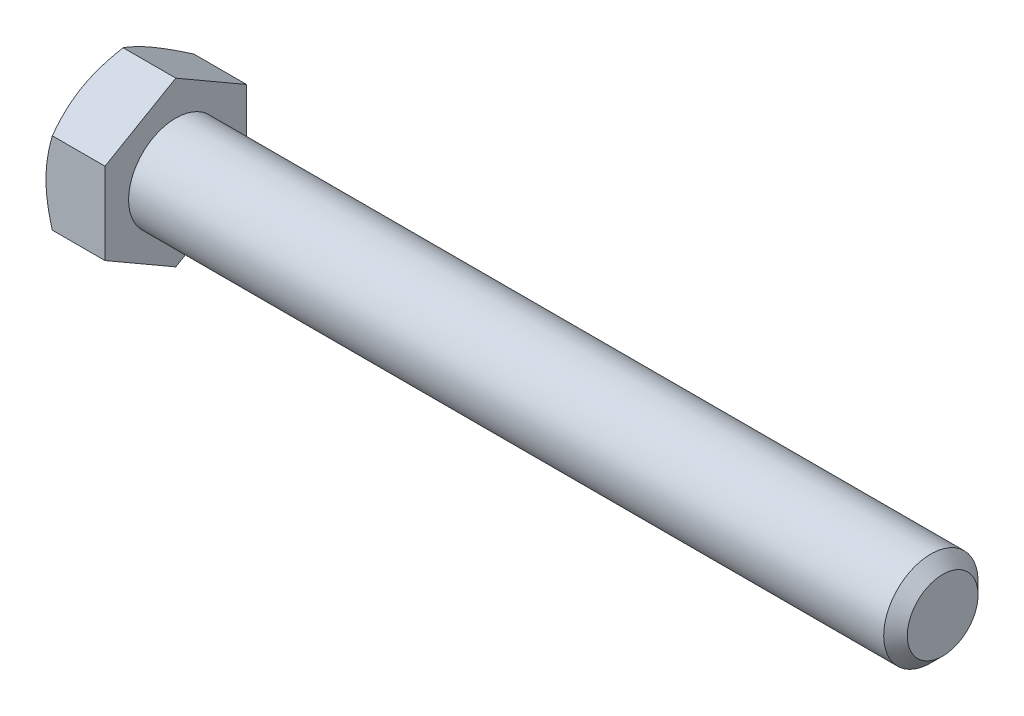
ISO-10303-21;
HEADER;
FILE_DESCRIPTION(('STEP AP214'),'2;1');
FILE_NAME('part.step','',(''),(''),'','','');
FILE_SCHEMA(('AUTOMOTIVE_DESIGN { 1 0 10303 214 1 1 1 1 }'));
ENDSEC;
DATA;
#1=APPLICATION_CONTEXT('core data for automotive mechanical design processes');
#2=APPLICATION_PROTOCOL_DEFINITION('international standard','automotive_design',2000,#1);
#3=PRODUCT_CONTEXT('',#1,'mechanical');
#4=PRODUCT('Part','Part','',(#3));
#5=PRODUCT_RELATED_PRODUCT_CATEGORY('part','',(#4));
#6=PRODUCT_DEFINITION_FORMATION('','',#4);
#7=PRODUCT_DEFINITION_CONTEXT('part definition',#1,'design');
#8=PRODUCT_DEFINITION('design','',#6,#7);
#9=PRODUCT_DEFINITION_SHAPE('','',#8);
#10=(LENGTH_UNIT() NAMED_UNIT(*) SI_UNIT(.MILLI.,.METRE.));
#11=(NAMED_UNIT(*) PLANE_ANGLE_UNIT() SI_UNIT($,.RADIAN.));
#12=(NAMED_UNIT(*) SI_UNIT($,.STERADIAN.) SOLID_ANGLE_UNIT());
#13=UNCERTAINTY_MEASURE_WITH_UNIT(LENGTH_MEASURE(1.E-05),#10,'distance_accuracy_value','');
#14=(GEOMETRIC_REPRESENTATION_CONTEXT(3) GLOBAL_UNCERTAINTY_ASSIGNED_CONTEXT((#13)) GLOBAL_UNIT_ASSIGNED_CONTEXT((#10,
#11,#12)) REPRESENTATION_CONTEXT('',''));
#15=CARTESIAN_POINT('',(0.,0.,0.));
#16=DIRECTION('',(0.,0.,1.));
#17=DIRECTION('',(1.,0.,0.));
#18=AXIS2_PLACEMENT_3D('',#15,#16,#17);
#19=CARTESIAN_POINT('',(5.,3.46410161513774,-6.));
#20=DIRECTION('',(0.,-0.866025403784438,0.500000000000001));
#21=DIRECTION('',(0.,-0.500000000000001,-0.866025403784438));
#22=AXIS2_PLACEMENT_3D('',#19,#20,#21);
#23=PLANE('',#22);
#24=CARTESIAN_POINT('',(0.535965053195557,6.92831870032934,0.000199999999999566));
#25=CARTESIAN_POINT('',(0.492008999115932,6.85217369681759,-0.131687014824876));
#26=CARTESIAN_POINT('',(0.450047807220406,6.7757447877387,-0.264065768516575));
#27=CARTESIAN_POINT('',(0.370664576794794,6.62226628317933,-0.529898336283081));
#28=CARTESIAN_POINT('',(0.333244496395652,6.54521643511296,-0.663352587849512));
#29=CARTESIAN_POINT('',(0.228530410086183,6.31283321525997,-1.06585213146133));
#30=CARTESIAN_POINT('',(0.16897005738191,6.15658254390818,-1.33648623295938));
#31=CARTESIAN_POINT('',(0.0991282107152327,5.92275625451824,-1.74148524632806));
#32=CARTESIAN_POINT('',(0.0792322280518294,5.84587929350304,-1.87464004873788));
#33=CARTESIAN_POINT('',(0.0458694147989662,5.69177799808121,-2.14155132192067));
#34=CARTESIAN_POINT('',(0.032402016158874,5.61455369497579,-2.27530773847834));
#35=CARTESIAN_POINT('',(0.0122395917503633,5.45997096038122,-2.54305288876907));
#36=CARTESIAN_POINT('',(0.00553687999985954,5.38261278137646,-2.67704118518633));
#37=CARTESIAN_POINT('',(-0.000959636589873951,5.22782922676437,-2.94513416595058));
#38=CARTESIAN_POINT('',(-0.000753654851924433,5.15040385330669,-3.07923884657427));
#39=CARTESIAN_POINT('',(0.00930718522571211,4.93828180440545,-3.44664501267683));
#40=CARTESIAN_POINT('',(0.0261978930022797,4.8036545605159,-3.6798262391765));
#41=CARTESIAN_POINT('',(0.0797592227905724,4.53529425885133,-4.14463991639404));
#42=CARTESIAN_POINT('',(0.116448152963761,4.40156214490545,-4.3762707323519));
#43=CARTESIAN_POINT('',(0.208160126695705,4.13266173796311,-4.84201989935198));
#44=CARTESIAN_POINT('',(0.263571756710662,3.99752737632064,-5.07607947956512));
#45=CARTESIAN_POINT('',(0.389333913183387,3.72927392501649,-5.54070808652961));
#46=CARTESIAN_POINT('',(0.459654897316178,3.59615139973115,-5.77128306395569));
#47=CARTESIAN_POINT('',(0.535965053195556,3.46398614508391,-6.0002));
#48=B_SPLINE_CURVE_WITH_KNOTS('',3,(#24,#25,#26,#27,#28,#29,#30,#31,#32,#33,#34,#35,#36,#37,#38,
#39,#40,#41,#42,#43,#44,#45,#46,#47),.UNSPECIFIED.,.F.,.F.,(4,2,2,2,2,2,2,2,2,2,2,4),(0.,
0.475482194578527,0.951168694392478,1.90451835622162,2.36951738073402,2.83447530880776,
3.29890435872167,3.76331906154278,4.57182194271094,5.38107376137308,6.20827406017204,
7.03385036012984),.UNSPECIFIED.);
#49=CARTESIAN_POINT('',(0.535898384862252,6.92820323027551,0.));
#50=VERTEX_POINT('',#49);
#51=CARTESIAN_POINT('',(0.,5.19615242270662,-3.));
#52=VERTEX_POINT('',#51);
#53=EDGE_CURVE('E57',#50,#52,#48,.T.);
#54=ORIENTED_EDGE('',*,*,#53,.F.);
#55=DIRECTION('',(-1.,0.,0.));
#56=VECTOR('',#55,1.);
#57=CARTESIAN_POINT('',(5.,6.92820323027551,0.));
#58=LINE('',#57,#56);
#59=CARTESIAN_POINT('',(5.,6.92820323027551,0.));
#60=VERTEX_POINT('',#59);
#61=EDGE_CURVE('E237',#60,#50,#58,.T.);
#62=ORIENTED_EDGE('',*,*,#61,.F.);
#63=DIRECTION('',(0.,0.500000000000001,0.866025403784438));
#64=VECTOR('',#63,1.);
#65=CARTESIAN_POINT('',(5.,3.46410161513774,-6.));
#66=LINE('',#65,#64);
#67=CARTESIAN_POINT('',(5.,3.46410161513774,-6.));
#68=VERTEX_POINT('',#67);
#69=EDGE_CURVE('E256',#68,#60,#66,.T.);
#70=ORIENTED_EDGE('',*,*,#69,.F.);
#71=DIRECTION('',(-1.,0.,0.));
#72=VECTOR('',#71,1.);
#73=CARTESIAN_POINT('',(5.,3.46410161513774,-6.));
#74=LINE('',#73,#72);
#75=CARTESIAN_POINT('',(0.53589838486225,3.46410161513774,-6.));
#76=VERTEX_POINT('',#75);
#77=EDGE_CURVE('E128',#68,#76,#74,.T.);
#78=ORIENTED_EDGE('',*,*,#77,.T.);
#79=EDGE_CURVE('E145',#52,#76,#48,.T.);
#80=ORIENTED_EDGE('',*,*,#79,.F.);
#81=EDGE_LOOP('',(#54,#62,#70,#78,#80));
#82=FACE_BOUND('',#81,.T.);
#83=ADVANCED_FACE('F40',(#82),#23,.F.);
#84=CARTESIAN_POINT('',(5.,6.92820323027551,0.));
#85=DIRECTION('',(0.,-0.866025403784438,-0.500000000000001));
#86=DIRECTION('',(0.,0.500000000000001,-0.866025403784438));
#87=AXIS2_PLACEMENT_3D('',#84,#85,#86);
#88=PLANE('',#87);
#89=CARTESIAN_POINT('',(0.535965053195555,3.46398614508391,6.0002));
#90=CARTESIAN_POINT('',(0.492008999115931,3.54013114859567,5.86831298517512));
#91=CARTESIAN_POINT('',(0.450047807220404,3.61656005767456,5.73593423148343));
#92=CARTESIAN_POINT('',(0.370664576794793,3.77003856223392,5.47010166371692));
#93=CARTESIAN_POINT('',(0.33324449639565,3.8470884103003,5.33664741215049));
#94=CARTESIAN_POINT('',(0.228530410086181,4.07947163015328,4.93414786853867));
#95=CARTESIAN_POINT('',(0.168970057381909,4.23572230150507,4.66351376704062));
#96=CARTESIAN_POINT('',(0.0991282107152322,4.46954859089502,4.25851475367194));
#97=CARTESIAN_POINT('',(0.079232228051829,4.54642555191021,4.12535995126212));
#98=CARTESIAN_POINT('',(0.0458694147989658,4.70052684733204,3.85844867807934));
#99=CARTESIAN_POINT('',(0.0324020161588735,4.77775115043746,3.72469226152166));
#100=CARTESIAN_POINT('',(0.0122395917503627,4.93233388503203,3.45694711123093));
#101=CARTESIAN_POINT('',(0.00553687999985882,5.00969206403679,3.32295881481367));
#102=CARTESIAN_POINT('',(-0.000959636589874331,5.16447561864888,3.05486583404942));
#103=CARTESIAN_POINT('',(-0.000753654851924385,5.24190099210656,2.92076115342573));
#104=CARTESIAN_POINT('',(0.00930718522571288,5.4540230410078,2.55335498732317));
#105=CARTESIAN_POINT('',(0.0261978930022804,5.58865028489735,2.3201737608235));
#106=CARTESIAN_POINT('',(0.0797592227905732,5.85701058656192,1.85536008360596));
#107=CARTESIAN_POINT('',(0.116448152963762,5.9907427005078,1.6237292676481));
#108=CARTESIAN_POINT('',(0.208160126695706,6.25964310745014,1.15798010064802));
#109=CARTESIAN_POINT('',(0.263571756710663,6.39477746909261,0.923920520434877));
#110=CARTESIAN_POINT('',(0.389333913183389,6.66303092039676,0.459291913470389));
#111=CARTESIAN_POINT('',(0.459654897316179,6.7961534456821,0.228716936044309));
#112=CARTESIAN_POINT('',(0.535965053195557,6.92831870032935,-0.000199999999999965));
#113=B_SPLINE_CURVE_WITH_KNOTS('',3,(#89,#90,#91,#92,#93,#94,#95,#96,#97,#98,#99,#100,#101,#102,
#103,#104,#105,#106,#107,#108,#109,#110,#111,#112),.UNSPECIFIED.,.F.,.F.,(4,2,2,2,2,2,2,2,2,2,2,
4),(0.,0.475482194578526,0.951168694392478,1.90451835622161,2.36951738073402,2.83447530880776,
3.29890435872167,3.76331906154278,4.57182194271094,5.38107376137308,6.20827406017204,
7.03385036012984),.UNSPECIFIED.);
#114=CARTESIAN_POINT('',(0.53589838486225,3.46410161513774,6.));
#115=VERTEX_POINT('',#114);
#116=CARTESIAN_POINT('',(0.,5.19615242270663,3.));
#117=VERTEX_POINT('',#116);
#118=EDGE_CURVE('E64',#115,#117,#113,.T.);
#119=ORIENTED_EDGE('',*,*,#118,.F.);
#120=DIRECTION('',(-1.,0.,0.));
#121=VECTOR('',#120,1.);
#122=CARTESIAN_POINT('',(5.,3.46410161513774,6.));
#123=LINE('',#122,#121);
#124=CARTESIAN_POINT('',(5.,3.46410161513774,6.));
#125=VERTEX_POINT('',#124);
#126=EDGE_CURVE('E234',#125,#115,#123,.T.);
#127=ORIENTED_EDGE('',*,*,#126,.F.);
#128=DIRECTION('',(0.,-0.500000000000001,0.866025403784438));
#129=VECTOR('',#128,1.);
#130=CARTESIAN_POINT('',(5.,6.92820323027551,0.));
#131=LINE('',#130,#129);
#132=EDGE_CURVE('E262',#60,#125,#131,.T.);
#133=ORIENTED_EDGE('',*,*,#132,.F.);
#134=ORIENTED_EDGE('',*,*,#61,.T.);
#135=EDGE_CURVE('E219',#117,#50,#113,.T.);
#136=ORIENTED_EDGE('',*,*,#135,.F.);
#137=EDGE_LOOP('',(#119,#127,#133,#134,#136));
#138=FACE_BOUND('',#137,.T.);
#139=ADVANCED_FACE('F222',(#138),#88,.F.);
#140=CARTESIAN_POINT('',(5.,3.46410161513774,6.));
#141=DIRECTION('',(0.,0.,-1.));
#142=DIRECTION('',(-1.,0.,0.));
#143=AXIS2_PLACEMENT_3D('',#140,#141,#142);
#144=PLANE('',#143);
#145=CARTESIAN_POINT('',(2.93626828606138,-9.32170610009385,6.));
#146=CARTESIAN_POINT('',(2.8090135134472,-9.05951190628665,6.));
#147=CARTESIAN_POINT('',(2.68297405928228,-8.79671762926234,6.));
#148=CARTESIAN_POINT('',(2.43400894505058,-8.26960987280578,6.));
#149=CARTESIAN_POINT('',(2.31108377237892,-8.00529616342247,6.));
#150=CARTESIAN_POINT('',(2.06841549364098,-7.47347663231218,6.));
#151=CARTESIAN_POINT('',(1.9486932101972,-7.20596127649309,6.));
#152=CARTESIAN_POINT('',(1.71412558965074,-6.66880873703187,6.));
#153=CARTESIAN_POINT('',(1.59928002328981,-6.39917165384172,6.));
#154=CARTESIAN_POINT('',(1.37213058848121,-5.84856699021154,6.));
#155=CARTESIAN_POINT('',(1.26002952220788,-5.56751528877811,6.));
#156=CARTESIAN_POINT('',(1.04427130570613,-5.0021296228829,6.));
#157=CARTESIAN_POINT('',(0.940615100882791,-4.71779529498689,6.));
#158=CARTESIAN_POINT('',(0.74445530871319,-4.14591998619683,6.));
#159=CARTESIAN_POINT('',(0.651929285984039,-3.85838677717122,6.));
#160=CARTESIAN_POINT('',(0.48098897843878,-3.27919259499723,6.));
#161=CARTESIAN_POINT('',(0.402570266294493,-2.98753294796123,6.));
#162=CARTESIAN_POINT('',(0.264013375039683,-2.40156398503359,6.));
#163=CARTESIAN_POINT('',(0.203775050379133,-2.10727873326851,6.));
#164=CARTESIAN_POINT('',(0.10498297366646,-1.51498915824554,6.));
#165=CARTESIAN_POINT('',(0.0664271467041732,-1.21698519364124,6.));
#166=CARTESIAN_POINT('',(0.0274146313264827,-0.770358069192724,6.));
#167=CARTESIAN_POINT('',(0.0175519001835222,-0.622519732156791,6.));
#168=CARTESIAN_POINT('',(0.00408268347945877,-0.32655187803913,6.));
#169=CARTESIAN_POINT('',(0.000476093707522703,-0.178422365848761,6.));
#170=CARTESIAN_POINT('',(-0.000387845204689659,0.117854678419315,6.));
#171=CARTESIAN_POINT('',(0.00235481599916097,0.266002210525987,6.));
#172=CARTESIAN_POINT('',(0.0141202627435244,0.562049990878019,6.));
#173=CARTESIAN_POINT('',(0.0231433593262367,0.709950226512205,6.));
#174=CARTESIAN_POINT('',(0.0521439081253017,1.06490129257947,6.));
#175=CARTESIAN_POINT('',(0.075073798771089,1.27171598786079,6.));
#176=CARTESIAN_POINT('',(0.131967500449313,1.68381163023179,6.));
#177=CARTESIAN_POINT('',(0.165932798125202,1.8890923668592,6.));
#178=CARTESIAN_POINT('',(0.282580985496877,2.50239892059866,6.));
#179=CARTESIAN_POINT('',(0.379994979130473,2.90766007312813,6.));
#180=CARTESIAN_POINT('',(0.548935108179694,3.51363600658177,6.));
#181=CARTESIAN_POINT('',(0.609836180137632,3.71749378500048,6.));
#182=CARTESIAN_POINT('',(0.737968925970619,4.1232295204079,6.));
#183=CARTESIAN_POINT('',(0.80520064149628,4.32510746436123,6.));
#184=CARTESIAN_POINT('',(0.944915562214485,4.72694670205538,6.));
#185=CARTESIAN_POINT('',(1.01739703837223,4.92690860250721,6.));
#186=CARTESIAN_POINT('',(1.16675817640586,5.32517554145051,6.));
#187=CARTESIAN_POINT('',(1.24363778765898,5.52348059898222,6.));
#188=CARTESIAN_POINT('',(1.42944213479154,5.9898421017752,6.));
#189=CARTESIAN_POINT('',(1.53992878409299,6.25727508939657,6.));
#190=CARTESIAN_POINT('',(1.76625561377916,6.78987288885967,6.));
#191=CARTESIAN_POINT('',(1.88209611859102,7.05503756209167,6.));
#192=CARTESIAN_POINT('',(2.11806079059879,7.58351311792788,6.));
#193=CARTESIAN_POINT('',(2.2381858180636,7.84682361538737,6.));
#194=CARTESIAN_POINT('',(2.48186617475508,8.371855406861,6.));
#195=CARTESIAN_POINT('',(2.60542157754345,8.6335766666483,6.));
#196=CARTESIAN_POINT('',(2.85545234171435,9.15596233466339,6.));
#197=CARTESIAN_POINT('',(2.98193068320438,9.41662531411354,6.));
#198=CARTESIAN_POINT('',(3.23718552692362,9.93682464715284,6.));
#199=CARTESIAN_POINT('',(3.36596204984605,10.1963609905714,6.));
#200=CARTESIAN_POINT('',(3.75509549616944,10.973479051883,6.));
#201=CARTESIAN_POINT('',(4.01829003255247,11.4896397043699,6.));
#202=CARTESIAN_POINT('',(4.52780030483426,12.4762048495075,6.));
#203=CARTESIAN_POINT('',(4.7736898619577,12.9468304327198,6.));
#204=CARTESIAN_POINT('',(5.26884672089446,13.8863212535174,6.));
#205=CARTESIAN_POINT('',(5.51811414161721,14.355186428386,6.));
#206=CARTESIAN_POINT('',(6.01859679565314,15.2903725212524,6.));
#207=CARTESIAN_POINT('',(6.26980563344779,15.7566968674377,6.));
#208=CARTESIAN_POINT('',(6.77424322350886,16.6882189188858,6.));
#209=CARTESIAN_POINT('',(7.02747186332098,17.1534166850179,6.));
#210=CARTESIAN_POINT('',(7.28145484601343,17.6181994250083,6.));
#211=B_SPLINE_CURVE_WITH_KNOTS('',3,(#145,#146,#147,#148,#149,#150,#151,#152,#153,#154,#155,
#156,#157,#158,#159,#160,#161,#162,#163,#164,#165,#166,#167,#168,#169,#170,#171,#172,#173,#174,
#175,#176,#177,#178,#179,#180,#181,#182,#183,#184,#185,#186,#187,#188,#189,#190,#191,#192,#193,
#194,#195,#196,#197,#198,#199,#200,#201,#202,#203,#204,#205,#206,#207,#208,#209,#210),
.UNSPECIFIED.,.F.,.F.,(4,2,2,2,2,2,2,2,2,2,2,2,2,2,2,2,2,2,2,2,2,2,2,2,2,2,2,2,2,2,2,2,4),(0.,
0.874342436809959,1.7488208761481,2.62803215387148,3.50720205332843,4.41484744716247,
5.32259431297415,6.22847960957262,7.13408011235274,8.03459708605002,8.93502786995782,
9.37941648573478,9.8237976990971,10.2681796364407,10.7125835836232,11.3364773076989,
11.9604551149771,13.2090975905326,13.8473249919481,14.4855565926871,15.1235789362434,
15.7615939376065,16.6295877113989,17.4976341520764,18.3658558758224,19.2340962323015,
20.1032646939316,20.9724409856598,22.7105607402823,24.3035153698487,25.8965262219254,
27.4855704858609,29.074526887444),.UNSPECIFIED.);
#212=CARTESIAN_POINT('',(0.535898384862257,-3.46410161513777,6.));
#213=VERTEX_POINT('',#212);
#214=CARTESIAN_POINT('',(0.,0.,6.));
#215=VERTEX_POINT('',#214);
#216=EDGE_CURVE('E206',#213,#215,#211,.T.);
#217=ORIENTED_EDGE('',*,*,#216,.F.);
#218=DIRECTION('',(-1.,0.,0.));
#219=VECTOR('',#218,1.);
#220=CARTESIAN_POINT('',(5.,-3.46410161513777,6.));
#221=LINE('',#220,#219);
#222=CARTESIAN_POINT('',(5.,-3.46410161513777,6.));
#223=VERTEX_POINT('',#222);
#224=EDGE_CURVE('E280',#223,#213,#221,.T.);
#225=ORIENTED_EDGE('',*,*,#224,.F.);
#226=DIRECTION('',(0.,-1.,0.));
#227=VECTOR('',#226,1.);
#228=CARTESIAN_POINT('',(5.,3.46410161513774,6.));
#229=LINE('',#228,#227);
#230=EDGE_CURVE('E265',#125,#223,#229,.T.);
#231=ORIENTED_EDGE('',*,*,#230,.F.);
#232=ORIENTED_EDGE('',*,*,#126,.T.);
#233=EDGE_CURVE('E212',#215,#115,#211,.T.);
#234=ORIENTED_EDGE('',*,*,#233,.F.);
#235=EDGE_LOOP('',(#217,#225,#231,#232,#234));
#236=FACE_BOUND('',#235,.T.);
#237=ADVANCED_FACE('F194',(#236),#144,.F.);
#238=CARTESIAN_POINT('',(5.,-6.92820323027551,0.));
#239=DIRECTION('',(0.,0.86602540378444,-0.499999999999998));
#240=DIRECTION('',(0.,0.499999999999998,0.86602540378444));
#241=AXIS2_PLACEMENT_3D('',#238,#239,#240);
#242=PLANE('',#241);
#243=CARTESIAN_POINT('',(0.535965053195558,-6.92831870032935,-0.000200000000000444));
#244=CARTESIAN_POINT('',(0.492008999115933,-6.85217369681759,0.131687014824875));
#245=CARTESIAN_POINT('',(0.450047807220407,-6.7757447877387,0.264065768516574));
#246=CARTESIAN_POINT('',(0.370664576794796,-6.62226628317934,0.52989833628308));
#247=CARTESIAN_POINT('',(0.333244496395654,-6.54521643511296,0.663352587849512));
#248=CARTESIAN_POINT('',(0.228530410086185,-6.31283321525997,1.06585213146133));
#249=CARTESIAN_POINT('',(0.168970057381912,-6.15658254390819,1.33648623295938));
#250=CARTESIAN_POINT('',(0.0991282107152367,-5.92275625451824,1.74148524632807));
#251=CARTESIAN_POINT('',(0.079232228051834,-5.84587929350304,1.87464004873788));
#252=CARTESIAN_POINT('',(0.0458694147989708,-5.69177799808122,2.14155132192067));
#253=CARTESIAN_POINT('',(0.0324020161588779,-5.6145536949758,2.27530773847835));
#254=CARTESIAN_POINT('',(0.0122395917503677,-5.45997096038123,2.54305288876908));
#255=CARTESIAN_POINT('',(0.00553687999986496,-5.38261278137647,2.67704118518634));
#256=CARTESIAN_POINT('',(-0.000959636589867566,-5.22782922676438,2.94513416595059));
#257=CARTESIAN_POINT('',(-0.000753654851918155,-5.1504038533067,3.07923884657428));
#258=CARTESIAN_POINT('',(0.00930718522571865,-4.93828180440547,3.44664501267684));
#259=CARTESIAN_POINT('',(0.0261978930022869,-4.80365456051591,3.67982623917651));
#260=CARTESIAN_POINT('',(0.0797592227905806,-4.53529425885135,4.14463991639405));
#261=CARTESIAN_POINT('',(0.11644815296377,-4.40156214490547,4.3762707323519));
#262=CARTESIAN_POINT('',(0.208160126695713,-4.13266173796313,4.84201989935198));
#263=CARTESIAN_POINT('',(0.263571756710669,-3.99752737632066,5.07607947956512));
#264=CARTESIAN_POINT('',(0.389333913183394,-3.72927392501652,5.54070808652961));
#265=CARTESIAN_POINT('',(0.459654897316185,-3.59615139973118,5.77128306395569));
#266=CARTESIAN_POINT('',(0.535965053195562,-3.46398614508393,6.0002));
#267=B_SPLINE_CURVE_WITH_KNOTS('',3,(#243,#244,#245,#246,#247,#248,#249,#250,#251,#252,#253,
#254,#255,#256,#257,#258,#259,#260,#261,#262,#263,#264,#265,#266),.UNSPECIFIED.,.F.,.F.,(4,2,2,
2,2,2,2,2,2,2,2,4),(0.,0.475482194578526,0.951168694392478,1.90451835622162,2.36951738073402,
2.83447530880777,3.29890435872168,3.76331906154279,4.57182194271094,5.38107376137307,
6.20827406017203,7.03385036012983),.UNSPECIFIED.);
#268=CARTESIAN_POINT('',(0.535898384862252,-6.92820323027551,0.));
#269=VERTEX_POINT('',#268);
#270=CARTESIAN_POINT('',(0.,-5.19615242270664,2.99999999999999));
#271=VERTEX_POINT('',#270);
#272=EDGE_CURVE('E160',#269,#271,#267,.T.);
#273=ORIENTED_EDGE('',*,*,#272,.F.);
#274=DIRECTION('',(-1.,0.,0.));
#275=VECTOR('',#274,1.);
#276=CARTESIAN_POINT('',(5.,-6.92820323027551,0.));
#277=LINE('',#276,#275);
#278=CARTESIAN_POINT('',(5.,-6.92820323027551,0.));
#279=VERTEX_POINT('',#278);
#280=EDGE_CURVE('E127',#279,#269,#277,.T.);
#281=ORIENTED_EDGE('',*,*,#280,.F.);
#282=DIRECTION('',(0.,-0.499999999999998,-0.86602540378444));
#283=VECTOR('',#282,1.);
#284=CARTESIAN_POINT('',(5.,-6.92820323027551,0.));
#285=LINE('',#284,#283);
#286=EDGE_CURVE('E268',#223,#279,#285,.T.);
#287=ORIENTED_EDGE('',*,*,#286,.F.);
#288=ORIENTED_EDGE('',*,*,#224,.T.);
#289=EDGE_CURVE('E167',#271,#213,#267,.T.);
#290=ORIENTED_EDGE('',*,*,#289,.F.);
#291=EDGE_LOOP('',(#273,#281,#287,#288,#290));
#292=FACE_BOUND('',#291,.T.);
#293=ADVANCED_FACE('F190',(#292),#242,.F.);
#294=CARTESIAN_POINT('',(5.,-3.46410161513777,-6.));
#295=DIRECTION('',(0.,0.86602540378444,0.499999999999998));
#296=DIRECTION('',(0.,-0.499999999999998,0.86602540378444));
#297=AXIS2_PLACEMENT_3D('',#294,#295,#296);
#298=PLANE('',#297);
#299=CARTESIAN_POINT('',(0.535965053195563,-3.46398614508393,-6.0002));
#300=CARTESIAN_POINT('',(0.492008999115938,-3.54013114859569,-5.86831298517512));
#301=CARTESIAN_POINT('',(0.450047807220412,-3.61656005767458,-5.73593423148343));
#302=CARTESIAN_POINT('',(0.370664576794801,-3.77003856223394,-5.47010166371692));
#303=CARTESIAN_POINT('',(0.333244496395658,-3.84708841030032,-5.33664741215049));
#304=CARTESIAN_POINT('',(0.228530410086189,-4.0794716301533,-4.93414786853867));
#305=CARTESIAN_POINT('',(0.168970057381916,-4.23572230150509,-4.66351376704062));
#306=CARTESIAN_POINT('',(0.0991282107152395,-4.46954859089504,-4.25851475367193));
#307=CARTESIAN_POINT('',(0.0792322280518364,-4.54642555191024,-4.12535995126212));
#308=CARTESIAN_POINT('',(0.0458694147989728,-4.70052684733206,-3.85844867807933));
#309=CARTESIAN_POINT('',(0.0324020161588797,-4.77775115043748,-3.72469226152165));
#310=CARTESIAN_POINT('',(0.0122395917503689,-4.93233388503205,-3.45694711123092));
#311=CARTESIAN_POINT('',(0.00553687999986566,-5.00969206403681,-3.32295881481366));
#312=CARTESIAN_POINT('',(-0.000959636589867325,-5.1644756186489,-3.05486583404941));
#313=CARTESIAN_POINT('',(-0.000753654851917872,-5.24190099210658,-2.92076115342572));
#314=CARTESIAN_POINT('',(0.00930718522571869,-5.45402304100781,-2.55335498732316));
#315=CARTESIAN_POINT('',(0.0261978930022864,-5.58865028489737,-2.32017376082349));
#316=CARTESIAN_POINT('',(0.079759222790579,-5.85701058656193,-1.85536008360595));
#317=CARTESIAN_POINT('',(0.116448152963768,-5.99074270050781,-1.62372926764809));
#318=CARTESIAN_POINT('',(0.20816012669571,-6.25964310745015,-1.15798010064802));
#319=CARTESIAN_POINT('',(0.263571756710666,-6.39477746909262,-0.923920520434875));
#320=CARTESIAN_POINT('',(0.389333913183391,-6.66303092039676,-0.459291913470389));
#321=CARTESIAN_POINT('',(0.45965489731618,-6.7961534456821,-0.228716936044309));
#322=CARTESIAN_POINT('',(0.535965053195557,-6.92831870032935,0.000199999999999275));
#323=B_SPLINE_CURVE_WITH_KNOTS('',3,(#299,#300,#301,#302,#303,#304,#305,#306,#307,#308,#309,
#310,#311,#312,#313,#314,#315,#316,#317,#318,#319,#320,#321,#322),.UNSPECIFIED.,.F.,.F.,(4,2,2,
2,2,2,2,2,2,2,2,4),(0.,0.475482194578526,0.951168694392479,1.90451835622162,2.36951738073403,
2.83447530880777,3.29890435872168,3.76331906154279,4.57182194271094,5.38107376137307,
6.20827406017204,7.03385036012983),.UNSPECIFIED.);
#324=CARTESIAN_POINT('',(0.535898384862257,-3.46410161513777,-6.));
#325=VERTEX_POINT('',#324);
#326=CARTESIAN_POINT('',(0.,-5.19615242270664,-2.99999999999999));
#327=VERTEX_POINT('',#326);
#328=EDGE_CURVE('E134',#325,#327,#323,.T.);
#329=ORIENTED_EDGE('',*,*,#328,.F.);
#330=DIRECTION('',(-1.,0.,0.));
#331=VECTOR('',#330,1.);
#332=CARTESIAN_POINT('',(5.,-3.46410161513777,-6.));
#333=LINE('',#332,#331);
#334=CARTESIAN_POINT('',(5.,-3.46410161513777,-6.));
#335=VERTEX_POINT('',#334);
#336=EDGE_CURVE('E116',#335,#325,#333,.T.);
#337=ORIENTED_EDGE('',*,*,#336,.F.);
#338=DIRECTION('',(0.,0.499999999999998,-0.86602540378444));
#339=VECTOR('',#338,1.);
#340=CARTESIAN_POINT('',(5.,-3.46410161513777,-6.));
#341=LINE('',#340,#339);
#342=EDGE_CURVE('E271',#279,#335,#341,.T.);
#343=ORIENTED_EDGE('',*,*,#342,.F.);
#344=ORIENTED_EDGE('',*,*,#280,.T.);
#345=EDGE_CURVE('E143',#327,#269,#323,.T.);
#346=ORIENTED_EDGE('',*,*,#345,.F.);
#347=EDGE_LOOP('',(#329,#337,#343,#344,#346));
#348=FACE_BOUND('',#347,.T.);
#349=ADVANCED_FACE('F141',(#348),#298,.F.);
#350=CARTESIAN_POINT('',(5.,3.46410161513774,-6.));
#351=DIRECTION('',(0.,0.,1.));
#352=DIRECTION('',(1.,0.,0.));
#353=AXIS2_PLACEMENT_3D('',#350,#351,#352);
#354=PLANE('',#353);
#355=CARTESIAN_POINT('',(2.93626828606138,-9.32170610009385,-6.));
#356=CARTESIAN_POINT('',(2.8090135134472,-9.05951190628665,-6.));
#357=CARTESIAN_POINT('',(2.68297405928228,-8.79671762926235,-6.));
#358=CARTESIAN_POINT('',(2.43400894505058,-8.26960987280578,-6.));
#359=CARTESIAN_POINT('',(2.31108377237892,-8.00529616342247,-6.));
#360=CARTESIAN_POINT('',(2.06841549364099,-7.47347663231218,-6.));
#361=CARTESIAN_POINT('',(1.9486932101972,-7.20596127649309,-6.));
#362=CARTESIAN_POINT('',(1.71412558965074,-6.66880873703187,-6.));
#363=CARTESIAN_POINT('',(1.59928002328981,-6.39917165384173,-6.));
#364=CARTESIAN_POINT('',(1.37213058848122,-5.84856699021154,-6.));
#365=CARTESIAN_POINT('',(1.26002952220788,-5.56751528877812,-6.));
#366=CARTESIAN_POINT('',(1.04427130570613,-5.0021296228829,-6.));
#367=CARTESIAN_POINT('',(0.940615100882792,-4.7177952949869,-6.));
#368=CARTESIAN_POINT('',(0.744455308713192,-4.14591998619683,-6.));
#369=CARTESIAN_POINT('',(0.651929285984041,-3.85838677717122,-6.));
#370=CARTESIAN_POINT('',(0.480988978438781,-3.27919259499723,-6.));
#371=CARTESIAN_POINT('',(0.402570266294494,-2.98753294796123,-6.));
#372=CARTESIAN_POINT('',(0.264013375039683,-2.40156398503358,-6.));
#373=CARTESIAN_POINT('',(0.203775050379133,-2.10727873326851,-6.));
#374=CARTESIAN_POINT('',(0.10498297366646,-1.51498915824553,-6.));
#375=CARTESIAN_POINT('',(0.066427146704174,-1.21698519364123,-6.));
#376=CARTESIAN_POINT('',(0.0274146313264834,-0.770358069192722,-6.));
#377=CARTESIAN_POINT('',(0.0175519001835227,-0.62251973215679,-6.));
#378=CARTESIAN_POINT('',(0.00408268347945942,-0.326551878039129,-6.));
#379=CARTESIAN_POINT('',(0.000476093707523836,-0.17842236584876,-6.));
#380=CARTESIAN_POINT('',(-0.000387845204688552,0.117854678419316,-6.));
#381=CARTESIAN_POINT('',(0.00235481599916155,0.266002210525989,-6.));
#382=CARTESIAN_POINT('',(0.0141202627435248,0.562049990878021,-6.));
#383=CARTESIAN_POINT('',(0.0231433593262376,0.709950226512207,-6.));
#384=CARTESIAN_POINT('',(0.0521439081253029,1.06490129257947,-6.));
#385=CARTESIAN_POINT('',(0.0750737987710898,1.27171598786079,-6.));
#386=CARTESIAN_POINT('',(0.131967500449313,1.68381163023179,-6.));
#387=CARTESIAN_POINT('',(0.165932798125203,1.8890923668592,-6.));
#388=CARTESIAN_POINT('',(0.282580985496879,2.50239892059866,-6.));
#389=CARTESIAN_POINT('',(0.379994979130474,2.90766007312814,-6.));
#390=CARTESIAN_POINT('',(0.548935108179695,3.51363600658177,-6.));
#391=CARTESIAN_POINT('',(0.609836180137634,3.71749378500048,-6.));
#392=CARTESIAN_POINT('',(0.73796892597062,4.12322952040791,-6.));
#393=CARTESIAN_POINT('',(0.805200641496282,4.32510746436123,-6.));
#394=CARTESIAN_POINT('',(0.944915562214487,4.72694670205538,-6.));
#395=CARTESIAN_POINT('',(1.01739703837223,4.92690860250722,-6.));
#396=CARTESIAN_POINT('',(1.16675817640586,5.32517554145051,-6.));
#397=CARTESIAN_POINT('',(1.24363778765898,5.52348059898222,-6.));
#398=CARTESIAN_POINT('',(1.42944213479154,5.9898421017752,-6.));
#399=CARTESIAN_POINT('',(1.53992878409299,6.25727508939658,-6.));
#400=CARTESIAN_POINT('',(1.76625561377916,6.78987288885967,-6.));
#401=CARTESIAN_POINT('',(1.88209611859102,7.05503756209168,-6.));
#402=CARTESIAN_POINT('',(2.11806079059879,7.58351311792789,-6.));
#403=CARTESIAN_POINT('',(2.23818581806361,7.84682361538737,-6.));
#404=CARTESIAN_POINT('',(2.48186617475509,8.37185540686101,-6.));
#405=CARTESIAN_POINT('',(2.60542157754345,8.63357666664831,-6.));
#406=CARTESIAN_POINT('',(2.85545234171435,9.1559623346634,-6.));
#407=CARTESIAN_POINT('',(2.98193068320438,9.41662531411354,-6.));
#408=CARTESIAN_POINT('',(3.23718552692362,9.93682464715284,-6.));
#409=CARTESIAN_POINT('',(3.36596204984606,10.1963609905714,-6.));
#410=CARTESIAN_POINT('',(3.75509549616944,10.973479051883,-6.));
#411=CARTESIAN_POINT('',(4.01829003255247,11.4896397043699,-6.));
#412=CARTESIAN_POINT('',(4.52780030483426,12.4762048495075,-6.));
#413=CARTESIAN_POINT('',(4.7736898619577,12.9468304327198,-6.));
#414=CARTESIAN_POINT('',(5.26884672089446,13.8863212535174,-6.));
#415=CARTESIAN_POINT('',(5.51811414161722,14.355186428386,-6.));
#416=CARTESIAN_POINT('',(6.01859679565314,15.2903725212524,-6.));
#417=CARTESIAN_POINT('',(6.2698056334478,15.7566968674377,-6.));
#418=CARTESIAN_POINT('',(6.77424322350886,16.6882189188858,-6.));
#419=CARTESIAN_POINT('',(7.02747186332098,17.1534166850179,-6.));
#420=CARTESIAN_POINT('',(7.28145484601343,17.6181994250083,-6.));
#421=B_SPLINE_CURVE_WITH_KNOTS('',3,(#355,#356,#357,#358,#359,#360,#361,#362,#363,#364,#365,
#366,#367,#368,#369,#370,#371,#372,#373,#374,#375,#376,#377,#378,#379,#380,#381,#382,#383,#384,
#385,#386,#387,#388,#389,#390,#391,#392,#393,#394,#395,#396,#397,#398,#399,#400,#401,#402,#403,
#404,#405,#406,#407,#408,#409,#410,#411,#412,#413,#414,#415,#416,#417,#418,#419,#420),
.UNSPECIFIED.,.F.,.F.,(4,2,2,2,2,2,2,2,2,2,2,2,2,2,2,2,2,2,2,2,2,2,2,2,2,2,2,2,2,2,2,2,4),(0.,
0.874342436809959,1.74882087614809,2.62803215387148,3.50720205332843,4.41484744716246,
5.32259431297415,6.22847960957263,7.13408011235274,8.03459708605003,8.93502786995782,
9.37941648573478,9.8237976990971,10.2681796364407,10.7125835836232,11.3364773076989,
11.9604551149771,13.2090975905326,13.8473249919481,14.4855565926871,15.1235789362434,
15.7615939376065,16.6295877113989,17.4976341520764,18.3658558758224,19.2340962323015,
20.1032646939316,20.9724409856598,22.7105607402823,24.3035153698487,25.8965262219254,
27.4855704858609,29.074526887444),.UNSPECIFIED.);
#422=CARTESIAN_POINT('',(0.,0.,-6.));
#423=VERTEX_POINT('',#422);
#424=EDGE_CURVE('E139',#76,#423,#421,.F.);
#425=ORIENTED_EDGE('',*,*,#424,.F.);
#426=ORIENTED_EDGE('',*,*,#77,.F.);
#427=DIRECTION('',(0.,1.,0.));
#428=VECTOR('',#427,1.);
#429=CARTESIAN_POINT('',(5.,3.46410161513774,-6.));
#430=LINE('',#429,#428);
#431=EDGE_CURVE('E122',#335,#68,#430,.T.);
#432=ORIENTED_EDGE('',*,*,#431,.F.);
#433=ORIENTED_EDGE('',*,*,#336,.T.);
#434=EDGE_CURVE('E120',#423,#325,#421,.F.);
#435=ORIENTED_EDGE('',*,*,#434,.F.);
#436=EDGE_LOOP('',(#425,#426,#432,#433,#435));
#437=FACE_BOUND('',#436,.T.);
#438=ADVANCED_FACE('F119',(#437),#354,.F.);
#439=CARTESIAN_POINT('',(5.,6.92820323027551,0.));
#440=DIRECTION('',(1.,0.,0.));
#441=DIRECTION('',(0.,0.,-1.));
#442=AXIS2_PLACEMENT_3D('',#439,#440,#441);
#443=PLANE('',#442);
#444=CARTESIAN_POINT('',(5.,0.,0.));
#445=DIRECTION('',(1.,0.,0.));
#446=DIRECTION('',(0.,0.,-1.));
#447=AXIS2_PLACEMENT_3D('',#444,#445,#446);
#448=CIRCLE('',#447,4.);
#449=CARTESIAN_POINT('',(5.,0.,-4.));
#450=VERTEX_POINT('',#449);
#451=EDGE_CURVE('E250',#450,#450,#448,.F.);
#452=ORIENTED_EDGE('',*,*,#451,.T.);
#453=EDGE_LOOP('',(#452));
#454=FACE_BOUND('',#453,.T.);
#455=ORIENTED_EDGE('',*,*,#69,.T.);
#456=ORIENTED_EDGE('',*,*,#132,.T.);
#457=ORIENTED_EDGE('',*,*,#230,.T.);
#458=ORIENTED_EDGE('',*,*,#286,.T.);
#459=ORIENTED_EDGE('',*,*,#342,.T.);
#460=ORIENTED_EDGE('',*,*,#431,.T.);
#461=EDGE_LOOP('',(#455,#456,#457,#458,#459,#460));
#462=FACE_BOUND('',#461,.T.);
#463=ADVANCED_FACE('F184',(#454,#462),#443,.T.);
#464=CARTESIAN_POINT('',(0.,0.,0.));
#465=DIRECTION('',(-1.,0.,0.));
#466=DIRECTION('',(0.,0.,1.));
#467=AXIS2_PLACEMENT_3D('',#464,#465,#466);
#468=CYLINDRICAL_SURFACE('',#467,4.);
#469=ORIENTED_EDGE('',*,*,#451,.F.);
#470=EDGE_LOOP('',(#469));
#471=FACE_BOUND('',#470,.T.);
#472=CARTESIAN_POINT('',(69.,0.,0.));
#473=DIRECTION('',(-1.,0.,0.));
#474=DIRECTION('',(0.,0.,1.));
#475=AXIS2_PLACEMENT_3D('',#472,#473,#474);
#476=CIRCLE('',#475,4.);
#477=CARTESIAN_POINT('',(69.,0.,4.));
#478=VERTEX_POINT('',#477);
#479=EDGE_CURVE('E244',#478,#478,#476,.T.);
#480=ORIENTED_EDGE('',*,*,#479,.T.);
#481=EDGE_LOOP('',(#480));
#482=FACE_BOUND('',#481,.T.);
#483=ADVANCED_FACE('F343',(#471,#482),#468,.T.);
#484=CARTESIAN_POINT('',(70.,0.,0.));
#485=DIRECTION('',(-1.,0.,0.));
#486=DIRECTION('',(0.,0.,1.));
#487=AXIS2_PLACEMENT_3D('',#484,#485,#486);
#488=CONICAL_SURFACE('',#487,3.,0.785398163397448);
#489=ORIENTED_EDGE('',*,*,#479,.F.);
#490=EDGE_LOOP('',(#489));
#491=FACE_BOUND('',#490,.T.);
#492=CARTESIAN_POINT('',(70.,0.,0.));
#493=DIRECTION('',(-1.,0.,0.));
#494=DIRECTION('',(0.,0.,1.));
#495=AXIS2_PLACEMENT_3D('',#492,#493,#494);
#496=CIRCLE('',#495,3.);
#497=CARTESIAN_POINT('',(70.,0.,3.));
#498=VERTEX_POINT('',#497);
#499=EDGE_CURVE('E220',#498,#498,#496,.T.);
#500=ORIENTED_EDGE('',*,*,#499,.T.);
#501=EDGE_LOOP('',(#500));
#502=FACE_BOUND('',#501,.T.);
#503=ADVANCED_FACE('F338',(#491,#502),#488,.T.);
#504=CARTESIAN_POINT('',(70.,0.,0.));
#505=DIRECTION('',(-1.,0.,0.));
#506=DIRECTION('',(0.,0.,1.));
#507=AXIS2_PLACEMENT_3D('',#504,#505,#506);
#508=PLANE('',#507);
#509=ORIENTED_EDGE('',*,*,#499,.F.);
#510=EDGE_LOOP('',(#509));
#511=FACE_BOUND('',#510,.T.);
#512=ADVANCED_FACE('F334',(#511),#508,.F.);
#513=CARTESIAN_POINT('',(-1.5,0.,0.));
#514=DIRECTION('',(1.,0.,0.));
#515=DIRECTION('',(0.,0.,-1.));
#516=AXIS2_PLACEMENT_3D('',#513,#514,#515);
#517=CONICAL_SURFACE('',#516,3.40192378864668,1.0471975511966);
#518=ORIENTED_EDGE('',*,*,#328,.T.);
#519=CARTESIAN_POINT('',(0.,0.,0.));
#520=DIRECTION('',(1.,0.,0.));
#521=DIRECTION('',(0.,0.,-1.));
#522=AXIS2_PLACEMENT_3D('',#519,#520,#521);
#523=CIRCLE('',#522,5.99999999999999);
#524=EDGE_CURVE('E44',#327,#423,#523,.T.);
#525=ORIENTED_EDGE('',*,*,#524,.T.);
#526=ORIENTED_EDGE('',*,*,#434,.T.);
#527=EDGE_LOOP('',(#518,#525,#526));
#528=FACE_BOUND('',#527,.T.);
#529=ADVANCED_FACE('F133',(#528),#517,.T.);
#530=ORIENTED_EDGE('',*,*,#272,.T.);
#531=EDGE_CURVE('E286',#271,#327,#523,.T.);
#532=ORIENTED_EDGE('',*,*,#531,.T.);
#533=ORIENTED_EDGE('',*,*,#345,.T.);
#534=EDGE_LOOP('',(#530,#532,#533));
#535=FACE_BOUND('',#534,.T.);
#536=ADVANCED_FACE('F319',(#535),#517,.T.);
#537=ORIENTED_EDGE('',*,*,#216,.T.);
#538=EDGE_CURVE('E288',#215,#271,#523,.T.);
#539=ORIENTED_EDGE('',*,*,#538,.T.);
#540=ORIENTED_EDGE('',*,*,#289,.T.);
#541=EDGE_LOOP('',(#537,#539,#540));
#542=FACE_BOUND('',#541,.T.);
#543=ADVANCED_FACE('F313',(#542),#517,.T.);
#544=ORIENTED_EDGE('',*,*,#118,.T.);
#545=EDGE_CURVE('E293',#117,#215,#523,.T.);
#546=ORIENTED_EDGE('',*,*,#545,.T.);
#547=ORIENTED_EDGE('',*,*,#233,.T.);
#548=EDGE_LOOP('',(#544,#546,#547));
#549=FACE_BOUND('',#548,.T.);
#550=ADVANCED_FACE('F311',(#549),#517,.T.);
#551=ORIENTED_EDGE('',*,*,#53,.T.);
#552=EDGE_CURVE('E50',#52,#117,#523,.T.);
#553=ORIENTED_EDGE('',*,*,#552,.T.);
#554=ORIENTED_EDGE('',*,*,#135,.T.);
#555=EDGE_LOOP('',(#551,#553,#554));
#556=FACE_BOUND('',#555,.T.);
#557=ADVANCED_FACE('F178',(#556),#517,.T.);
#558=ORIENTED_EDGE('',*,*,#424,.T.);
#559=EDGE_CURVE('E11',#423,#52,#523,.T.);
#560=ORIENTED_EDGE('',*,*,#559,.T.);
#561=ORIENTED_EDGE('',*,*,#79,.T.);
#562=EDGE_LOOP('',(#558,#560,#561));
#563=FACE_BOUND('',#562,.T.);
#564=ADVANCED_FACE('F318',(#563),#517,.T.);
#565=CARTESIAN_POINT('',(0.,6.92820323027551,0.));
#566=DIRECTION('',(1.,0.,0.));
#567=DIRECTION('',(0.,0.,-1.));
#568=AXIS2_PLACEMENT_3D('',#565,#566,#567);
#569=PLANE('',#568);
#570=ORIENTED_EDGE('',*,*,#559,.F.);
#571=ORIENTED_EDGE('',*,*,#524,.F.);
#572=ORIENTED_EDGE('',*,*,#531,.F.);
#573=ORIENTED_EDGE('',*,*,#538,.F.);
#574=ORIENTED_EDGE('',*,*,#545,.F.);
#575=ORIENTED_EDGE('',*,*,#552,.F.);
#576=EDGE_LOOP('',(#570,#571,#572,#573,#574,#575));
#577=FACE_BOUND('',#576,.T.);
#578=ADVANCED_FACE('F185',(#577),#569,.F.);
#579=CLOSED_SHELL('',(#83,#139,#237,#293,#349,#438,#463,#483,#503,#512,#529,#536,#543,#550,#557,
#564,#578));
#580=MANIFOLD_SOLID_BREP('B2',#579);
#581=ADVANCED_BREP_SHAPE_REPRESENTATION('',(#18,#580),#14);
#582=SHAPE_DEFINITION_REPRESENTATION(#9,#581);
ENDSEC;
END-ISO-10303-21;
